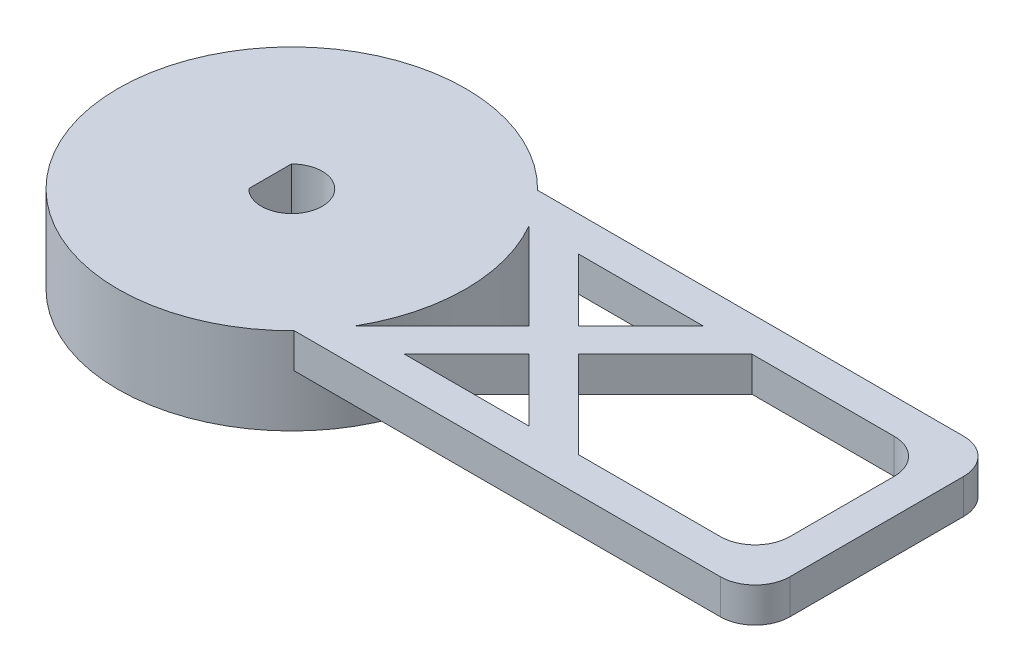
ISO-10303-21;
HEADER;
FILE_DESCRIPTION(('STEP AP214'),'2;1');
FILE_NAME('part.step','',(''),(''),'','','');
FILE_SCHEMA(('AUTOMOTIVE_DESIGN { 1 0 10303 214 1 1 1 1 }'));
ENDSEC;
DATA;
#1=APPLICATION_CONTEXT('core data for automotive mechanical design processes');
#2=APPLICATION_PROTOCOL_DEFINITION('international standard','automotive_design',2000,#1);
#3=PRODUCT_CONTEXT('',#1,'mechanical');
#4=PRODUCT('Part','Part','',(#3));
#5=PRODUCT_RELATED_PRODUCT_CATEGORY('part','',(#4));
#6=PRODUCT_DEFINITION_FORMATION('','',#4);
#7=PRODUCT_DEFINITION_CONTEXT('part definition',#1,'design');
#8=PRODUCT_DEFINITION('design','',#6,#7);
#9=PRODUCT_DEFINITION_SHAPE('','',#8);
#10=(LENGTH_UNIT() NAMED_UNIT(*) SI_UNIT(.MILLI.,.METRE.));
#11=(NAMED_UNIT(*) PLANE_ANGLE_UNIT() SI_UNIT($,.RADIAN.));
#12=(NAMED_UNIT(*) SI_UNIT($,.STERADIAN.) SOLID_ANGLE_UNIT());
#13=UNCERTAINTY_MEASURE_WITH_UNIT(LENGTH_MEASURE(1.E-05),#10,'distance_accuracy_value','');
#14=(GEOMETRIC_REPRESENTATION_CONTEXT(3) GLOBAL_UNCERTAINTY_ASSIGNED_CONTEXT((#13)) GLOBAL_UNIT_ASSIGNED_CONTEXT((#10,
#11,#12)) REPRESENTATION_CONTEXT('',''));
#15=CARTESIAN_POINT('',(0.,0.,0.));
#16=DIRECTION('',(0.,0.,1.));
#17=DIRECTION('',(1.,0.,0.));
#18=AXIS2_PLACEMENT_3D('',#15,#16,#17);
#19=CARTESIAN_POINT('',(8.66025403784439,3.,-5.));
#20=DIRECTION('',(0.,0.,1.));
#21=DIRECTION('',(1.,0.,0.));
#22=AXIS2_PLACEMENT_3D('',#19,#20,#21);
#23=PLANE('',#22);
#24=DIRECTION('',(0.,1.,0.));
#25=VECTOR('',#24,1.);
#26=CARTESIAN_POINT('',(11.4886811625905,3.,-4.99999999999992));
#27=LINE('',#26,#25);
#28=CARTESIAN_POINT('',(11.4886811625905,3.,-4.99999999999992));
#29=VERTEX_POINT('',#28);
#30=CARTESIAN_POINT('',(11.4886811625905,5.,-5.));
#31=VERTEX_POINT('',#30);
#32=EDGE_CURVE('E287',#29,#31,#27,.T.);
#33=ORIENTED_EDGE('',*,*,#32,.F.);
#34=DIRECTION('',(1.,0.,0.));
#35=VECTOR('',#34,1.);
#36=CARTESIAN_POINT('',(8.66025403784439,3.,-5.));
#37=LINE('',#36,#35);
#38=CARTESIAN_POINT('',(18.6602540378445,3.,-5.));
#39=VERTEX_POINT('',#38);
#40=EDGE_CURVE('E353',#29,#39,#37,.T.);
#41=ORIENTED_EDGE('',*,*,#40,.T.);
#42=DIRECTION('',(0.,1.,0.));
#43=VECTOR('',#42,1.);
#44=CARTESIAN_POINT('',(18.6602540378445,3.,-5.00000000000008));
#45=LINE('',#44,#43);
#46=CARTESIAN_POINT('',(18.6602540378445,5.,-5.));
#47=VERTEX_POINT('',#46);
#48=EDGE_CURVE('E295',#39,#47,#45,.T.);
#49=ORIENTED_EDGE('',*,*,#48,.T.);
#50=DIRECTION('',(1.,0.,0.));
#51=VECTOR('',#50,1.);
#52=CARTESIAN_POINT('',(8.66025403784439,5.,-5.));
#53=LINE('',#52,#51);
#54=EDGE_CURVE('E364',#31,#47,#53,.T.);
#55=ORIENTED_EDGE('',*,*,#54,.F.);
#56=EDGE_LOOP('',(#33,#41,#49,#55));
#57=FACE_BOUND('',#56,.T.);
#58=ADVANCED_FACE('F39',(#57),#23,.T.);
#59=CARTESIAN_POINT('',(8.66025403784439,3.,5.));
#60=DIRECTION('',(0.,0.,-1.));
#61=DIRECTION('',(-1.,0.,0.));
#62=AXIS2_PLACEMENT_3D('',#59,#60,#61);
#63=PLANE('',#62);
#64=DIRECTION('',(-1.,0.,0.));
#65=VECTOR('',#64,1.);
#66=CARTESIAN_POINT('',(8.66025403784439,5.,5.));
#67=LINE('',#66,#65);
#68=CARTESIAN_POINT('',(29.6602540378444,5.,5.));
#69=VERTEX_POINT('',#68);
#70=CARTESIAN_POINT('',(21.488681162591,5.,5.));
#71=VERTEX_POINT('',#70);
#72=EDGE_CURVE('E331',#69,#71,#67,.T.);
#73=ORIENTED_EDGE('',*,*,#72,.F.);
#74=DIRECTION('',(0.,1.,0.));
#75=VECTOR('',#74,1.);
#76=CARTESIAN_POINT('',(29.6602540378444,3.,5.));
#77=LINE('',#76,#75);
#78=CARTESIAN_POINT('',(29.6602540378444,3.,5.));
#79=VERTEX_POINT('',#78);
#80=EDGE_CURVE('E422',#69,#79,#77,.F.);
#81=ORIENTED_EDGE('',*,*,#80,.T.);
#82=DIRECTION('',(-1.,0.,0.));
#83=VECTOR('',#82,1.);
#84=CARTESIAN_POINT('',(8.66025403784439,3.,5.));
#85=LINE('',#84,#83);
#86=CARTESIAN_POINT('',(21.488681162591,3.,5.));
#87=VERTEX_POINT('',#86);
#88=EDGE_CURVE('E332',#79,#87,#85,.T.);
#89=ORIENTED_EDGE('',*,*,#88,.T.);
#90=DIRECTION('',(0.,1.,0.));
#91=VECTOR('',#90,1.);
#92=CARTESIAN_POINT('',(21.488681162591,3.,5.));
#93=LINE('',#92,#91);
#94=EDGE_CURVE('E305',#87,#71,#93,.T.);
#95=ORIENTED_EDGE('',*,*,#94,.T.);
#96=EDGE_LOOP('',(#73,#81,#89,#95));
#97=FACE_BOUND('',#96,.T.);
#98=ADVANCED_FACE('F483',(#97),#63,.T.);
#99=CARTESIAN_POINT('',(21.4886811625907,3.,-5.00000000000008));
#100=VERTEX_POINT('',#99);
#101=CARTESIAN_POINT('',(29.6602540378444,3.,-5.));
#102=VERTEX_POINT('',#101);
#103=EDGE_CURVE('E349',#100,#102,#37,.T.);
#104=ORIENTED_EDGE('',*,*,#103,.T.);
#105=DIRECTION('',(0.,-1.,0.));
#106=VECTOR('',#105,1.);
#107=CARTESIAN_POINT('',(29.6602540378444,3.,-5.));
#108=LINE('',#107,#106);
#109=CARTESIAN_POINT('',(29.6602540378444,5.,-5.));
#110=VERTEX_POINT('',#109);
#111=EDGE_CURVE('E425',#102,#110,#108,.F.);
#112=ORIENTED_EDGE('',*,*,#111,.T.);
#113=CARTESIAN_POINT('',(21.4886811625906,5.,-5.));
#114=VERTEX_POINT('',#113);
#115=EDGE_CURVE('E345',#114,#110,#53,.T.);
#116=ORIENTED_EDGE('',*,*,#115,.F.);
#117=DIRECTION('',(0.,1.,0.));
#118=VECTOR('',#117,1.);
#119=CARTESIAN_POINT('',(21.4886811625907,3.,-5.00000000000008));
#120=LINE('',#119,#118);
#121=EDGE_CURVE('E298',#100,#114,#120,.T.);
#122=ORIENTED_EDGE('',*,*,#121,.F.);
#123=EDGE_LOOP('',(#104,#112,#116,#122));
#124=FACE_BOUND('',#123,.T.);
#125=ADVANCED_FACE('F467',(#124),#23,.T.);
#126=DIRECTION('',(0.,1.,0.));
#127=VECTOR('',#126,1.);
#128=CARTESIAN_POINT('',(18.6602540378446,3.,5.));
#129=LINE('',#128,#127);
#130=CARTESIAN_POINT('',(18.6602540378446,3.,5.));
#131=VERTEX_POINT('',#130);
#132=CARTESIAN_POINT('',(18.6602540378446,5.,5.));
#133=VERTEX_POINT('',#132);
#134=EDGE_CURVE('E309',#131,#133,#129,.T.);
#135=ORIENTED_EDGE('',*,*,#134,.F.);
#136=CARTESIAN_POINT('',(11.4886811625907,3.,5.));
#137=VERTEX_POINT('',#136);
#138=EDGE_CURVE('E330',#131,#137,#85,.T.);
#139=ORIENTED_EDGE('',*,*,#138,.T.);
#140=DIRECTION('',(0.,1.,0.));
#141=VECTOR('',#140,1.);
#142=CARTESIAN_POINT('',(11.4886811625907,3.,4.99999999999991));
#143=LINE('',#142,#141);
#144=CARTESIAN_POINT('',(11.4886811625907,5.,5.));
#145=VERTEX_POINT('',#144);
#146=EDGE_CURVE('E214',#137,#145,#143,.T.);
#147=ORIENTED_EDGE('',*,*,#146,.T.);
#148=EDGE_CURVE('E339',#133,#145,#67,.T.);
#149=ORIENTED_EDGE('',*,*,#148,.F.);
#150=EDGE_LOOP('',(#135,#139,#147,#149));
#151=FACE_BOUND('',#150,.T.);
#152=ADVANCED_FACE('F513',(#151),#63,.T.);
#153=CARTESIAN_POINT('',(0.,5.,0.));
#154=DIRECTION('',(0.,1.,0.));
#155=DIRECTION('',(0.,0.,1.));
#156=AXIS2_PLACEMENT_3D('',#153,#154,#155);
#157=PLANE('',#156);
#158=DIRECTION('',(-0.707106781186573,0.,-0.707106781186522));
#159=VECTOR('',#158,1.);
#160=CARTESIAN_POINT('',(11.4886811625905,5.,-4.99999999999992));
#161=LINE('',#160,#159);
#162=CARTESIAN_POINT('',(15.0744676002176,5.,-1.41421356237313));
#163=VERTEX_POINT('',#162);
#164=EDGE_CURVE('E234',#163,#31,#161,.T.);
#165=ORIENTED_EDGE('',*,*,#164,.T.);
#166=ORIENTED_EDGE('',*,*,#54,.T.);
#167=DIRECTION('',(-0.707106781186543,0.,0.707106781186552));
#168=VECTOR('',#167,1.);
#169=CARTESIAN_POINT('',(18.6602540378445,5.,-5.00000000000008));
#170=LINE('',#169,#168);
#171=EDGE_CURVE('E238',#47,#163,#170,.T.);
#172=ORIENTED_EDGE('',*,*,#171,.T.);
#173=EDGE_LOOP('',(#165,#166,#172));
#174=FACE_BOUND('',#173,.T.);
#175=CARTESIAN_POINT('',(0.,5.,0.));
#176=DIRECTION('',(0.,1.,0.));
#177=DIRECTION('',(0.,0.,1.));
#178=AXIS2_PLACEMENT_3D('',#175,#176,#177);
#179=CIRCLE('',#178,10.);
#180=CARTESIAN_POINT('',(8.66025403784439,5.,5.));
#181=VERTEX_POINT('',#180);
#182=CARTESIAN_POINT('',(8.66025403784439,5.,-5.));
#183=VERTEX_POINT('',#182);
#184=EDGE_CURVE('E406',#181,#183,#179,.T.);
#185=ORIENTED_EDGE('',*,*,#184,.T.);
#186=DIRECTION('',(0.707106781186556,0.,0.707106781186539));
#187=VECTOR('',#186,1.);
#188=CARTESIAN_POINT('',(13.6602540378444,5.,0.));
#189=LINE('',#188,#187);
#190=CARTESIAN_POINT('',(13.6602540378444,5.,0.));
#191=VERTEX_POINT('',#190);
#192=EDGE_CURVE('E263',#183,#191,#189,.T.);
#193=ORIENTED_EDGE('',*,*,#192,.T.);
#194=DIRECTION('',(-0.707106781186543,0.,0.707106781186552));
#195=VECTOR('',#194,1.);
#196=CARTESIAN_POINT('',(13.6602540378444,5.,0.));
#197=LINE('',#196,#195);
#198=EDGE_CURVE('E208',#191,#181,#197,.T.);
#199=ORIENTED_EDGE('',*,*,#198,.T.);
#200=EDGE_LOOP('',(#185,#193,#199));
#201=FACE_BOUND('',#200,.T.);
#202=DIRECTION('',(0.,0.,1.));
#203=VECTOR('',#202,1.);
#204=CARTESIAN_POINT('',(31.6602540378444,5.,-10.002));
#205=LINE('',#204,#203);
#206=CARTESIAN_POINT('',(31.6602540378444,5.,-3.));
#207=VERTEX_POINT('',#206);
#208=CARTESIAN_POINT('',(31.6602540378444,5.,3.));
#209=VERTEX_POINT('',#208);
#210=EDGE_CURVE('E291',#207,#209,#205,.T.);
#211=ORIENTED_EDGE('',*,*,#210,.T.);
#212=CARTESIAN_POINT('',(29.6602540378444,5.,3.));
#213=DIRECTION('',(0.,1.,0.));
#214=DIRECTION('',(0.,0.,1.));
#215=AXIS2_PLACEMENT_3D('',#212,#213,#214);
#216=CIRCLE('',#215,2.);
#217=EDGE_CURVE('E452',#209,#69,#216,.F.);
#218=ORIENTED_EDGE('',*,*,#217,.T.);
#219=ORIENTED_EDGE('',*,*,#72,.T.);
#220=DIRECTION('',(-0.707106781186565,0.,-0.70710678118653));
#221=VECTOR('',#220,1.);
#222=CARTESIAN_POINT('',(16.4886811625907,5.,0.));
#223=LINE('',#222,#221);
#224=CARTESIAN_POINT('',(16.4886811625907,5.,0.));
#225=VERTEX_POINT('',#224);
#226=EDGE_CURVE('E276',#71,#225,#223,.T.);
#227=ORIENTED_EDGE('',*,*,#226,.T.);
#228=DIRECTION('',(0.707106781186541,0.,-0.707106781186554));
#229=VECTOR('',#228,1.);
#230=CARTESIAN_POINT('',(16.4886811625907,5.,0.));
#231=LINE('',#230,#229);
#232=EDGE_CURVE('E280',#225,#114,#231,.T.);
#233=ORIENTED_EDGE('',*,*,#232,.T.);
#234=ORIENTED_EDGE('',*,*,#115,.T.);
#235=CARTESIAN_POINT('',(29.6602540378444,5.,-3.));
#236=DIRECTION('',(0.,1.,0.));
#237=DIRECTION('',(0.,0.,1.));
#238=AXIS2_PLACEMENT_3D('',#235,#236,#237);
#239=CIRCLE('',#238,2.);
#240=EDGE_CURVE('E11',#110,#207,#239,.F.);
#241=ORIENTED_EDGE('',*,*,#240,.T.);
#242=EDGE_LOOP('',(#211,#218,#219,#227,#233,#234,#241));
#243=FACE_BOUND('',#242,.T.);
#244=DIRECTION('',(1.,0.,0.));
#245=VECTOR('',#244,1.);
#246=CARTESIAN_POINT('',(7.14142842854285,5.,7.));
#247=LINE('',#246,#245);
#248=CARTESIAN_POINT('',(7.14142842854285,5.,7.));
#249=VERTEX_POINT('',#248);
#250=CARTESIAN_POINT('',(31.6602540378444,5.,7.));
#251=VERTEX_POINT('',#250);
#252=EDGE_CURVE('E325',#249,#251,#247,.T.);
#253=ORIENTED_EDGE('',*,*,#252,.T.);
#254=CARTESIAN_POINT('',(31.6602540378444,5.,5.));
#255=DIRECTION('',(0.,1.,0.));
#256=DIRECTION('',(0.,0.,1.));
#257=AXIS2_PLACEMENT_3D('',#254,#255,#256);
#258=CIRCLE('',#257,2.);
#259=CARTESIAN_POINT('',(33.6602540378444,5.,5.));
#260=VERTEX_POINT('',#259);
#261=EDGE_CURVE('E435',#251,#260,#258,.T.);
#262=ORIENTED_EDGE('',*,*,#261,.T.);
#263=DIRECTION('',(0.,0.,-1.));
#264=VECTOR('',#263,1.);
#265=CARTESIAN_POINT('',(33.6602540378444,5.,-7.));
#266=LINE('',#265,#264);
#267=CARTESIAN_POINT('',(33.6602540378444,5.,-5.));
#268=VERTEX_POINT('',#267);
#269=EDGE_CURVE('E365',#260,#268,#266,.T.);
#270=ORIENTED_EDGE('',*,*,#269,.T.);
#271=CARTESIAN_POINT('',(31.6602540378444,5.,-5.));
#272=DIRECTION('',(0.,1.,0.));
#273=DIRECTION('',(0.,0.,1.));
#274=AXIS2_PLACEMENT_3D('',#271,#272,#273);
#275=CIRCLE('',#274,2.);
#276=CARTESIAN_POINT('',(31.6602540378444,5.,-7.));
#277=VERTEX_POINT('',#276);
#278=EDGE_CURVE('E432',#268,#277,#275,.T.);
#279=ORIENTED_EDGE('',*,*,#278,.T.);
#280=DIRECTION('',(-1.,0.,0.));
#281=VECTOR('',#280,1.);
#282=CARTESIAN_POINT('',(7.14142842854285,5.,-7.));
#283=LINE('',#282,#281);
#284=CARTESIAN_POINT('',(7.14142842854286,5.,-7.));
#285=VERTEX_POINT('',#284);
#286=EDGE_CURVE('E354',#277,#285,#283,.T.);
#287=ORIENTED_EDGE('',*,*,#286,.T.);
#288=EDGE_CURVE('E401',#285,#249,#179,.T.);
#289=ORIENTED_EDGE('',*,*,#288,.T.);
#290=EDGE_LOOP('',(#253,#262,#270,#279,#287,#289));
#291=FACE_BOUND('',#290,.T.);
#292=DIRECTION('',(0.707106781186565,0.,0.70710678118653));
#293=VECTOR('',#292,1.);
#294=CARTESIAN_POINT('',(18.6602540378446,5.,5.));
#295=LINE('',#294,#293);
#296=CARTESIAN_POINT('',(15.0744676002176,5.,1.41421356237312));
#297=VERTEX_POINT('',#296);
#298=EDGE_CURVE('E272',#297,#133,#295,.T.);
#299=ORIENTED_EDGE('',*,*,#298,.T.);
#300=ORIENTED_EDGE('',*,*,#148,.T.);
#301=DIRECTION('',(0.707106781186556,0.,-0.707106781186539));
#302=VECTOR('',#301,1.);
#303=CARTESIAN_POINT('',(11.4886811625907,5.,4.99999999999991));
#304=LINE('',#303,#302);
#305=EDGE_CURVE('E268',#145,#297,#304,.T.);
#306=ORIENTED_EDGE('',*,*,#305,.T.);
#307=EDGE_LOOP('',(#299,#300,#306));
#308=FACE_BOUND('',#307,.T.);
#309=DIRECTION('',(0.,0.,1.));
#310=VECTOR('',#309,1.);
#311=CARTESIAN_POINT('',(-1.25,5.,1.22474487139159));
#312=LINE('',#311,#310);
#313=CARTESIAN_POINT('',(-1.25,5.,-1.22474487139159));
#314=VERTEX_POINT('',#313);
#315=CARTESIAN_POINT('',(-1.25,5.,1.22474487139159));
#316=VERTEX_POINT('',#315);
#317=EDGE_CURVE('E382',#314,#316,#312,.T.);
#318=ORIENTED_EDGE('',*,*,#317,.F.);
#319=CARTESIAN_POINT('',(0.,5.,0.));
#320=DIRECTION('',(0.,1.,0.));
#321=DIRECTION('',(0.,0.,1.));
#322=AXIS2_PLACEMENT_3D('',#319,#320,#321);
#323=CIRCLE('',#322,1.75);
#324=EDGE_CURVE('E378',#316,#314,#323,.T.);
#325=ORIENTED_EDGE('',*,*,#324,.F.);
#326=EDGE_LOOP('',(#318,#325));
#327=FACE_BOUND('',#326,.T.);
#328=ADVANCED_FACE('F472',(#174,#201,#243,#291,#308,#327),#157,.T.);
#329=CARTESIAN_POINT('',(0.,0.,0.));
#330=DIRECTION('',(0.,1.,0.));
#331=DIRECTION('',(0.,0.,1.));
#332=AXIS2_PLACEMENT_3D('',#329,#330,#331);
#333=PLANE('',#332);
#334=CARTESIAN_POINT('',(0.,0.,0.));
#335=DIRECTION('',(0.,1.,0.));
#336=DIRECTION('',(0.,0.,1.));
#337=AXIS2_PLACEMENT_3D('',#334,#335,#336);
#338=CIRCLE('',#337,10.);
#339=CARTESIAN_POINT('',(0.,0.,10.));
#340=VERTEX_POINT('',#339);
#341=EDGE_CURVE('E400',#340,#340,#338,.T.);
#342=ORIENTED_EDGE('',*,*,#341,.F.);
#343=EDGE_LOOP('',(#342));
#344=FACE_BOUND('',#343,.T.);
#345=CARTESIAN_POINT('',(0.,0.,0.));
#346=DIRECTION('',(0.,1.,0.));
#347=DIRECTION('',(0.,0.,1.));
#348=AXIS2_PLACEMENT_3D('',#345,#346,#347);
#349=CIRCLE('',#348,1.75);
#350=CARTESIAN_POINT('',(-1.25,0.,1.22474487139159));
#351=VERTEX_POINT('',#350);
#352=CARTESIAN_POINT('',(-1.25,0.,-1.22474487139159));
#353=VERTEX_POINT('',#352);
#354=EDGE_CURVE('E375',#351,#353,#349,.T.);
#355=ORIENTED_EDGE('',*,*,#354,.T.);
#356=DIRECTION('',(0.,0.,1.));
#357=VECTOR('',#356,1.);
#358=CARTESIAN_POINT('',(-1.25,0.,1.22474487139159));
#359=LINE('',#358,#357);
#360=EDGE_CURVE('E383',#353,#351,#359,.T.);
#361=ORIENTED_EDGE('',*,*,#360,.T.);
#362=EDGE_LOOP('',(#355,#361));
#363=FACE_BOUND('',#362,.T.);
#364=ADVANCED_FACE('F526',(#344,#363),#333,.F.);
#365=CARTESIAN_POINT('',(0.,5.,0.));
#366=DIRECTION('',(0.,-1.,0.));
#367=DIRECTION('',(0.,0.,-1.));
#368=AXIS2_PLACEMENT_3D('',#365,#366,#367);
#369=CYLINDRICAL_SURFACE('',#368,10.);
#370=ORIENTED_EDGE('',*,*,#184,.F.);
#371=DIRECTION('',(0.,1.,0.));
#372=VECTOR('',#371,1.);
#373=CARTESIAN_POINT('',(8.66025403784439,3.,5.));
#374=LINE('',#373,#372);
#375=CARTESIAN_POINT('',(8.66025403784439,3.,5.));
#376=VERTEX_POINT('',#375);
#377=EDGE_CURVE('E342',#376,#181,#374,.T.);
#378=ORIENTED_EDGE('',*,*,#377,.F.);
#379=CARTESIAN_POINT('',(0.,3.,0.));
#380=DIRECTION('',(0.,-1.,0.));
#381=DIRECTION('',(0.,0.,-1.));
#382=AXIS2_PLACEMENT_3D('',#379,#380,#381);
#383=CIRCLE('',#382,10.);
#384=CARTESIAN_POINT('',(7.14142842854285,3.,7.));
#385=VERTEX_POINT('',#384);
#386=EDGE_CURVE('E225',#376,#385,#383,.T.);
#387=ORIENTED_EDGE('',*,*,#386,.T.);
#388=DIRECTION('',(0.,1.,0.));
#389=VECTOR('',#388,1.);
#390=CARTESIAN_POINT('',(7.14142842854285,3.,7.));
#391=LINE('',#390,#389);
#392=EDGE_CURVE('E335',#385,#249,#391,.T.);
#393=ORIENTED_EDGE('',*,*,#392,.T.);
#394=ORIENTED_EDGE('',*,*,#288,.F.);
#395=DIRECTION('',(0.,1.,0.));
#396=VECTOR('',#395,1.);
#397=CARTESIAN_POINT('',(7.14142842854285,3.,-7.));
#398=LINE('',#397,#396);
#399=CARTESIAN_POINT('',(7.14142842854285,3.,-7.));
#400=VERTEX_POINT('',#399);
#401=EDGE_CURVE('E371',#400,#285,#398,.T.);
#402=ORIENTED_EDGE('',*,*,#401,.F.);
#403=CARTESIAN_POINT('',(0.,3.,0.));
#404=DIRECTION('',(0.,1.,0.));
#405=DIRECTION('',(0.,0.,1.));
#406=AXIS2_PLACEMENT_3D('',#403,#404,#405);
#407=CIRCLE('',#406,10.);
#408=CARTESIAN_POINT('',(8.66025403784439,3.,-5.));
#409=VERTEX_POINT('',#408);
#410=EDGE_CURVE('E405',#409,#400,#407,.T.);
#411=ORIENTED_EDGE('',*,*,#410,.F.);
#412=DIRECTION('',(0.,1.,0.));
#413=VECTOR('',#412,1.);
#414=CARTESIAN_POINT('',(8.66025403784439,3.,-5.));
#415=LINE('',#414,#413);
#416=EDGE_CURVE('E232',#409,#183,#415,.T.);
#417=ORIENTED_EDGE('',*,*,#416,.T.);
#418=EDGE_LOOP('',(#370,#378,#387,#393,#394,#402,#411,#417));
#419=FACE_BOUND('',#418,.T.);
#420=ORIENTED_EDGE('',*,*,#341,.T.);
#421=EDGE_LOOP('',(#420));
#422=FACE_BOUND('',#421,.T.);
#423=ADVANCED_FACE('F557',(#419,#422),#369,.T.);
#424=CARTESIAN_POINT('',(0.,5.,0.));
#425=DIRECTION('',(0.,-1.,0.));
#426=DIRECTION('',(0.,0.,-1.));
#427=AXIS2_PLACEMENT_3D('',#424,#425,#426);
#428=CYLINDRICAL_SURFACE('',#427,1.75);
#429=ORIENTED_EDGE('',*,*,#354,.F.);
#430=DIRECTION('',(0.,-1.,0.));
#431=VECTOR('',#430,1.);
#432=CARTESIAN_POINT('',(-1.25,5.,1.22474487139159));
#433=LINE('',#432,#431);
#434=EDGE_CURVE('E386',#316,#351,#433,.T.);
#435=ORIENTED_EDGE('',*,*,#434,.F.);
#436=ORIENTED_EDGE('',*,*,#324,.T.);
#437=DIRECTION('',(0.,-1.,0.));
#438=VECTOR('',#437,1.);
#439=CARTESIAN_POINT('',(-1.25,5.,-1.22474487139159));
#440=LINE('',#439,#438);
#441=EDGE_CURVE('E396',#314,#353,#440,.T.);
#442=ORIENTED_EDGE('',*,*,#441,.T.);
#443=EDGE_LOOP('',(#429,#435,#436,#442));
#444=FACE_BOUND('',#443,.T.);
#445=ADVANCED_FACE('F574',(#444),#428,.F.);
#446=CARTESIAN_POINT('',(-1.25,5.,1.22474487139159));
#447=DIRECTION('',(1.,0.,0.));
#448=DIRECTION('',(0.,0.,-1.));
#449=AXIS2_PLACEMENT_3D('',#446,#447,#448);
#450=PLANE('',#449);
#451=ORIENTED_EDGE('',*,*,#360,.F.);
#452=ORIENTED_EDGE('',*,*,#441,.F.);
#453=ORIENTED_EDGE('',*,*,#317,.T.);
#454=ORIENTED_EDGE('',*,*,#434,.T.);
#455=EDGE_LOOP('',(#451,#452,#453,#454));
#456=FACE_BOUND('',#455,.T.);
#457=ADVANCED_FACE('F543',(#456),#450,.T.);
#458=CARTESIAN_POINT('',(7.14142842854285,3.,-7.));
#459=DIRECTION('',(0.,0.,-1.));
#460=DIRECTION('',(-1.,0.,0.));
#461=AXIS2_PLACEMENT_3D('',#458,#459,#460);
#462=PLANE('',#461);
#463=ORIENTED_EDGE('',*,*,#286,.F.);
#464=DIRECTION('',(0.,1.,0.));
#465=VECTOR('',#464,1.);
#466=CARTESIAN_POINT('',(31.6602540378444,3.,-7.));
#467=LINE('',#466,#465);
#468=CARTESIAN_POINT('',(31.6602540378444,3.,-7.));
#469=VERTEX_POINT('',#468);
#470=EDGE_CURVE('E55',#277,#469,#467,.F.);
#471=ORIENTED_EDGE('',*,*,#470,.T.);
#472=DIRECTION('',(-1.,0.,0.));
#473=VECTOR('',#472,1.);
#474=CARTESIAN_POINT('',(7.14142842854285,3.,-7.));
#475=LINE('',#474,#473);
#476=EDGE_CURVE('E358',#469,#400,#475,.T.);
#477=ORIENTED_EDGE('',*,*,#476,.T.);
#478=ORIENTED_EDGE('',*,*,#401,.T.);
#479=EDGE_LOOP('',(#463,#471,#477,#478));
#480=FACE_BOUND('',#479,.T.);
#481=ADVANCED_FACE('F541',(#480),#462,.T.);
#482=CARTESIAN_POINT('',(33.6602540378444,3.,-7.));
#483=DIRECTION('',(1.,0.,0.));
#484=DIRECTION('',(0.,0.,-1.));
#485=AXIS2_PLACEMENT_3D('',#482,#483,#484);
#486=PLANE('',#485);
#487=ORIENTED_EDGE('',*,*,#269,.F.);
#488=DIRECTION('',(0.,1.,0.));
#489=VECTOR('',#488,1.);
#490=CARTESIAN_POINT('',(33.6602540378444,3.,5.));
#491=LINE('',#490,#489);
#492=CARTESIAN_POINT('',(33.6602540378444,3.,5.));
#493=VERTEX_POINT('',#492);
#494=EDGE_CURVE('E442',#260,#493,#491,.F.);
#495=ORIENTED_EDGE('',*,*,#494,.T.);
#496=DIRECTION('',(0.,0.,-1.));
#497=VECTOR('',#496,1.);
#498=CARTESIAN_POINT('',(33.6602540378444,3.,-7.));
#499=LINE('',#498,#497);
#500=CARTESIAN_POINT('',(33.6602540378444,3.,-5.));
#501=VERTEX_POINT('',#500);
#502=EDGE_CURVE('E355',#493,#501,#499,.T.);
#503=ORIENTED_EDGE('',*,*,#502,.T.);
#504=DIRECTION('',(0.,1.,0.));
#505=VECTOR('',#504,1.);
#506=CARTESIAN_POINT('',(33.6602540378444,3.,-5.));
#507=LINE('',#506,#505);
#508=EDGE_CURVE('E438',#501,#268,#507,.T.);
#509=ORIENTED_EDGE('',*,*,#508,.T.);
#510=EDGE_LOOP('',(#487,#495,#503,#509));
#511=FACE_BOUND('',#510,.T.);
#512=ADVANCED_FACE('F539',(#511),#486,.T.);
#513=CARTESIAN_POINT('',(0.,3.,0.));
#514=DIRECTION('',(0.,1.,0.));
#515=DIRECTION('',(0.,0.,1.));
#516=AXIS2_PLACEMENT_3D('',#513,#514,#515);
#517=PLANE('',#516);
#518=ORIENTED_EDGE('',*,*,#40,.F.);
#519=DIRECTION('',(-0.707106781186573,0.,-0.707106781186522));
#520=VECTOR('',#519,1.);
#521=CARTESIAN_POINT('',(11.4886811625905,3.,-4.99999999999992));
#522=LINE('',#521,#520);
#523=CARTESIAN_POINT('',(15.0744676002176,3.,-1.41421356237313));
#524=VERTEX_POINT('',#523);
#525=EDGE_CURVE('E215',#524,#29,#522,.T.);
#526=ORIENTED_EDGE('',*,*,#525,.F.);
#527=DIRECTION('',(-0.707106781186543,0.,0.707106781186552));
#528=VECTOR('',#527,1.);
#529=CARTESIAN_POINT('',(18.6602540378445,3.,-5.00000000000008));
#530=LINE('',#529,#528);
#531=EDGE_CURVE('E256',#39,#524,#530,.T.);
#532=ORIENTED_EDGE('',*,*,#531,.F.);
#533=EDGE_LOOP('',(#518,#526,#532));
#534=FACE_BOUND('',#533,.T.);
#535=ORIENTED_EDGE('',*,*,#502,.F.);
#536=CARTESIAN_POINT('',(31.6602540378444,3.,5.));
#537=DIRECTION('',(0.,1.,0.));
#538=DIRECTION('',(0.,0.,1.));
#539=AXIS2_PLACEMENT_3D('',#536,#537,#538);
#540=CIRCLE('',#539,2.);
#541=CARTESIAN_POINT('',(31.6602540378444,3.,7.));
#542=VERTEX_POINT('',#541);
#543=EDGE_CURVE('E447',#493,#542,#540,.F.);
#544=ORIENTED_EDGE('',*,*,#543,.T.);
#545=DIRECTION('',(1.,0.,0.));
#546=VECTOR('',#545,1.);
#547=CARTESIAN_POINT('',(7.14142842854285,3.,7.));
#548=LINE('',#547,#546);
#549=EDGE_CURVE('E326',#385,#542,#548,.T.);
#550=ORIENTED_EDGE('',*,*,#549,.F.);
#551=ORIENTED_EDGE('',*,*,#386,.F.);
#552=DIRECTION('',(-0.707106781186543,0.,0.707106781186552));
#553=VECTOR('',#552,1.);
#554=CARTESIAN_POINT('',(13.6602540378444,3.,0.));
#555=LINE('',#554,#553);
#556=CARTESIAN_POINT('',(13.6602540378444,3.,0.));
#557=VERTEX_POINT('',#556);
#558=EDGE_CURVE('E206',#557,#376,#555,.T.);
#559=ORIENTED_EDGE('',*,*,#558,.F.);
#560=DIRECTION('',(0.707106781186556,0.,0.707106781186539));
#561=VECTOR('',#560,1.);
#562=CARTESIAN_POINT('',(13.6602540378444,3.,0.));
#563=LINE('',#562,#561);
#564=EDGE_CURVE('E222',#409,#557,#563,.T.);
#565=ORIENTED_EDGE('',*,*,#564,.F.);
#566=ORIENTED_EDGE('',*,*,#410,.T.);
#567=ORIENTED_EDGE('',*,*,#476,.F.);
#568=CARTESIAN_POINT('',(31.6602540378444,3.,-5.));
#569=DIRECTION('',(0.,1.,0.));
#570=DIRECTION('',(0.,0.,1.));
#571=AXIS2_PLACEMENT_3D('',#568,#569,#570);
#572=CIRCLE('',#571,2.);
#573=EDGE_CURVE('E62',#469,#501,#572,.F.);
#574=ORIENTED_EDGE('',*,*,#573,.T.);
#575=EDGE_LOOP('',(#535,#544,#550,#551,#559,#565,#566,#567,#574));
#576=FACE_BOUND('',#575,.T.);
#577=DIRECTION('',(-0.707106781186565,0.,-0.70710678118653));
#578=VECTOR('',#577,1.);
#579=CARTESIAN_POINT('',(16.4886811625907,3.,0.));
#580=LINE('',#579,#578);
#581=CARTESIAN_POINT('',(16.4886811625907,3.,0.));
#582=VERTEX_POINT('',#581);
#583=EDGE_CURVE('E248',#87,#582,#580,.T.);
#584=ORIENTED_EDGE('',*,*,#583,.F.);
#585=ORIENTED_EDGE('',*,*,#88,.F.);
#586=CARTESIAN_POINT('',(29.6602540378444,3.,3.));
#587=DIRECTION('',(0.,1.,0.));
#588=DIRECTION('',(0.,0.,1.));
#589=AXIS2_PLACEMENT_3D('',#586,#587,#588);
#590=CIRCLE('',#589,2.);
#591=CARTESIAN_POINT('',(31.6602540378444,3.,3.));
#592=VERTEX_POINT('',#591);
#593=EDGE_CURVE('E455',#79,#592,#590,.T.);
#594=ORIENTED_EDGE('',*,*,#593,.T.);
#595=DIRECTION('',(0.,0.,1.));
#596=VECTOR('',#595,1.);
#597=CARTESIAN_POINT('',(31.6602540378444,3.,-10.002));
#598=LINE('',#597,#596);
#599=CARTESIAN_POINT('',(31.6602540378444,3.,-3.));
#600=VERTEX_POINT('',#599);
#601=EDGE_CURVE('E321',#600,#592,#598,.T.);
#602=ORIENTED_EDGE('',*,*,#601,.F.);
#603=CARTESIAN_POINT('',(29.6602540378444,3.,-3.));
#604=DIRECTION('',(0.,1.,0.));
#605=DIRECTION('',(0.,0.,1.));
#606=AXIS2_PLACEMENT_3D('',#603,#604,#605);
#607=CIRCLE('',#606,2.);
#608=EDGE_CURVE('E48',#600,#102,#607,.T.);
#609=ORIENTED_EDGE('',*,*,#608,.T.);
#610=ORIENTED_EDGE('',*,*,#103,.F.);
#611=DIRECTION('',(0.707106781186541,0.,-0.707106781186554));
#612=VECTOR('',#611,1.);
#613=CARTESIAN_POINT('',(16.4886811625907,3.,0.));
#614=LINE('',#613,#612);
#615=EDGE_CURVE('E252',#582,#100,#614,.T.);
#616=ORIENTED_EDGE('',*,*,#615,.F.);
#617=EDGE_LOOP('',(#584,#585,#594,#602,#609,#610,#616));
#618=FACE_BOUND('',#617,.T.);
#619=ORIENTED_EDGE('',*,*,#138,.F.);
#620=DIRECTION('',(0.707106781186565,0.,0.70710678118653));
#621=VECTOR('',#620,1.);
#622=CARTESIAN_POINT('',(18.6602540378446,3.,5.));
#623=LINE('',#622,#621);
#624=CARTESIAN_POINT('',(15.0744676002176,3.,1.41421356237312));
#625=VERTEX_POINT('',#624);
#626=EDGE_CURVE('E244',#625,#131,#623,.T.);
#627=ORIENTED_EDGE('',*,*,#626,.F.);
#628=DIRECTION('',(0.707106781186556,0.,-0.707106781186539));
#629=VECTOR('',#628,1.);
#630=CARTESIAN_POINT('',(11.4886811625907,3.,4.99999999999991));
#631=LINE('',#630,#629);
#632=EDGE_CURVE('E227',#137,#625,#631,.T.);
#633=ORIENTED_EDGE('',*,*,#632,.F.);
#634=EDGE_LOOP('',(#619,#627,#633));
#635=FACE_BOUND('',#634,.T.);
#636=ADVANCED_FACE('F219',(#534,#576,#618,#635),#517,.F.);
#637=CARTESIAN_POINT('',(7.14142842854285,3.,7.));
#638=DIRECTION('',(0.,0.,1.));
#639=DIRECTION('',(1.,0.,0.));
#640=AXIS2_PLACEMENT_3D('',#637,#638,#639);
#641=PLANE('',#640);
#642=ORIENTED_EDGE('',*,*,#549,.T.);
#643=DIRECTION('',(0.,1.,0.));
#644=VECTOR('',#643,1.);
#645=CARTESIAN_POINT('',(31.6602540378444,3.,7.));
#646=LINE('',#645,#644);
#647=EDGE_CURVE('E428',#542,#251,#646,.T.);
#648=ORIENTED_EDGE('',*,*,#647,.T.);
#649=ORIENTED_EDGE('',*,*,#252,.F.);
#650=ORIENTED_EDGE('',*,*,#392,.F.);
#651=EDGE_LOOP('',(#642,#648,#649,#650));
#652=FACE_BOUND('',#651,.T.);
#653=ADVANCED_FACE('F533',(#652),#641,.T.);
#654=CARTESIAN_POINT('',(31.6602540378444,3.,-10.002));
#655=DIRECTION('',(1.,0.,0.));
#656=DIRECTION('',(0.,0.,-1.));
#657=AXIS2_PLACEMENT_3D('',#654,#655,#656);
#658=PLANE('',#657);
#659=ORIENTED_EDGE('',*,*,#601,.T.);
#660=DIRECTION('',(0.,1.,0.));
#661=VECTOR('',#660,1.);
#662=CARTESIAN_POINT('',(31.6602540378444,3.,3.));
#663=LINE('',#662,#661);
#664=EDGE_CURVE('E418',#592,#209,#663,.T.);
#665=ORIENTED_EDGE('',*,*,#664,.T.);
#666=ORIENTED_EDGE('',*,*,#210,.F.);
#667=DIRECTION('',(0.,-1.,0.));
#668=VECTOR('',#667,1.);
#669=CARTESIAN_POINT('',(31.6602540378444,3.,-3.));
#670=LINE('',#669,#668);
#671=EDGE_CURVE('E414',#207,#600,#670,.T.);
#672=ORIENTED_EDGE('',*,*,#671,.T.);
#673=EDGE_LOOP('',(#659,#665,#666,#672));
#674=FACE_BOUND('',#673,.T.);
#675=ADVANCED_FACE('F475',(#674),#658,.F.);
#676=CARTESIAN_POINT('',(11.4886811625905,3.,-4.99999999999992));
#677=DIRECTION('',(0.707106781186522,0.,-0.707106781186573));
#678=DIRECTION('',(-0.707106781186573,0.,-0.707106781186522));
#679=AXIS2_PLACEMENT_3D('',#676,#677,#678);
#680=PLANE('',#679);
#681=ORIENTED_EDGE('',*,*,#164,.F.);
#682=DIRECTION('',(0.,1.,0.));
#683=VECTOR('',#682,1.);
#684=CARTESIAN_POINT('',(15.0744676002176,3.,-1.41421356237313));
#685=LINE('',#684,#683);
#686=EDGE_CURVE('E292',#524,#163,#685,.T.);
#687=ORIENTED_EDGE('',*,*,#686,.F.);
#688=ORIENTED_EDGE('',*,*,#525,.T.);
#689=ORIENTED_EDGE('',*,*,#32,.T.);
#690=EDGE_LOOP('',(#681,#687,#688,#689));
#691=FACE_BOUND('',#690,.T.);
#692=ADVANCED_FACE('F501',(#691),#680,.T.);
#693=CARTESIAN_POINT('',(18.6602540378445,3.,-5.00000000000008));
#694=DIRECTION('',(-0.707106781186552,0.,-0.707106781186543));
#695=DIRECTION('',(-0.707106781186543,0.,0.707106781186552));
#696=AXIS2_PLACEMENT_3D('',#693,#694,#695);
#697=PLANE('',#696);
#698=ORIENTED_EDGE('',*,*,#171,.F.);
#699=ORIENTED_EDGE('',*,*,#48,.F.);
#700=ORIENTED_EDGE('',*,*,#531,.T.);
#701=ORIENTED_EDGE('',*,*,#686,.T.);
#702=EDGE_LOOP('',(#698,#699,#700,#701));
#703=FACE_BOUND('',#702,.T.);
#704=ADVANCED_FACE('F493',(#703),#697,.T.);
#705=CARTESIAN_POINT('',(16.4886811625907,3.,0.));
#706=DIRECTION('',(0.707106781186554,0.,0.707106781186541));
#707=DIRECTION('',(0.707106781186541,0.,-0.707106781186554));
#708=AXIS2_PLACEMENT_3D('',#705,#706,#707);
#709=PLANE('',#708);
#710=ORIENTED_EDGE('',*,*,#232,.F.);
#711=DIRECTION('',(0.,1.,0.));
#712=VECTOR('',#711,1.);
#713=CARTESIAN_POINT('',(16.4886811625907,3.,0.));
#714=LINE('',#713,#712);
#715=EDGE_CURVE('E302',#582,#225,#714,.T.);
#716=ORIENTED_EDGE('',*,*,#715,.F.);
#717=ORIENTED_EDGE('',*,*,#615,.T.);
#718=ORIENTED_EDGE('',*,*,#121,.T.);
#719=EDGE_LOOP('',(#710,#716,#717,#718));
#720=FACE_BOUND('',#719,.T.);
#721=ADVANCED_FACE('F491',(#720),#709,.T.);
#722=CARTESIAN_POINT('',(16.4886811625907,3.,0.));
#723=DIRECTION('',(0.70710678118653,0.,-0.707106781186565));
#724=DIRECTION('',(-0.707106781186565,0.,-0.70710678118653));
#725=AXIS2_PLACEMENT_3D('',#722,#723,#724);
#726=PLANE('',#725);
#727=ORIENTED_EDGE('',*,*,#226,.F.);
#728=ORIENTED_EDGE('',*,*,#94,.F.);
#729=ORIENTED_EDGE('',*,*,#583,.T.);
#730=ORIENTED_EDGE('',*,*,#715,.T.);
#731=EDGE_LOOP('',(#727,#728,#729,#730));
#732=FACE_BOUND('',#731,.T.);
#733=ADVANCED_FACE('F488',(#732),#726,.T.);
#734=CARTESIAN_POINT('',(18.6602540378446,3.,5.));
#735=DIRECTION('',(-0.70710678118653,0.,0.707106781186565));
#736=DIRECTION('',(0.707106781186565,0.,0.70710678118653));
#737=AXIS2_PLACEMENT_3D('',#734,#735,#736);
#738=PLANE('',#737);
#739=ORIENTED_EDGE('',*,*,#298,.F.);
#740=DIRECTION('',(0.,1.,0.));
#741=VECTOR('',#740,1.);
#742=CARTESIAN_POINT('',(15.0744676002176,3.,1.41421356237312));
#743=LINE('',#742,#741);
#744=EDGE_CURVE('E313',#625,#297,#743,.T.);
#745=ORIENTED_EDGE('',*,*,#744,.F.);
#746=ORIENTED_EDGE('',*,*,#626,.T.);
#747=ORIENTED_EDGE('',*,*,#134,.T.);
#748=EDGE_LOOP('',(#739,#745,#746,#747));
#749=FACE_BOUND('',#748,.T.);
#750=ADVANCED_FACE('F499',(#749),#738,.T.);
#751=CARTESIAN_POINT('',(11.4886811625907,3.,4.99999999999991));
#752=DIRECTION('',(0.707106781186539,0.,0.707106781186556));
#753=DIRECTION('',(0.707106781186556,0.,-0.707106781186539));
#754=AXIS2_PLACEMENT_3D('',#751,#752,#753);
#755=PLANE('',#754);
#756=ORIENTED_EDGE('',*,*,#305,.F.);
#757=ORIENTED_EDGE('',*,*,#146,.F.);
#758=ORIENTED_EDGE('',*,*,#632,.T.);
#759=ORIENTED_EDGE('',*,*,#744,.T.);
#760=EDGE_LOOP('',(#756,#757,#758,#759));
#761=FACE_BOUND('',#760,.T.);
#762=ADVANCED_FACE('F676',(#761),#755,.T.);
#763=CARTESIAN_POINT('',(13.6602540378444,3.,0.));
#764=DIRECTION('',(-0.707106781186552,0.,-0.707106781186543));
#765=DIRECTION('',(-0.707106781186543,0.,0.707106781186552));
#766=AXIS2_PLACEMENT_3D('',#763,#764,#765);
#767=PLANE('',#766);
#768=ORIENTED_EDGE('',*,*,#198,.F.);
#769=DIRECTION('',(0.,1.,0.));
#770=VECTOR('',#769,1.);
#771=CARTESIAN_POINT('',(13.6602540378444,3.,0.));
#772=LINE('',#771,#770);
#773=EDGE_CURVE('E202',#557,#191,#772,.T.);
#774=ORIENTED_EDGE('',*,*,#773,.F.);
#775=ORIENTED_EDGE('',*,*,#558,.T.);
#776=ORIENTED_EDGE('',*,*,#377,.T.);
#777=EDGE_LOOP('',(#768,#774,#775,#776));
#778=FACE_BOUND('',#777,.T.);
#779=ADVANCED_FACE('F204',(#778),#767,.T.);
#780=CARTESIAN_POINT('',(13.6602540378444,3.,0.));
#781=DIRECTION('',(-0.707106781186539,0.,0.707106781186556));
#782=DIRECTION('',(0.707106781186556,0.,0.707106781186539));
#783=AXIS2_PLACEMENT_3D('',#780,#781,#782);
#784=PLANE('',#783);
#785=ORIENTED_EDGE('',*,*,#192,.F.);
#786=ORIENTED_EDGE('',*,*,#416,.F.);
#787=ORIENTED_EDGE('',*,*,#564,.T.);
#788=ORIENTED_EDGE('',*,*,#773,.T.);
#789=EDGE_LOOP('',(#785,#786,#787,#788));
#790=FACE_BOUND('',#789,.T.);
#791=ADVANCED_FACE('F230',(#790),#784,.T.);
#792=CARTESIAN_POINT('',(29.6602540378444,3.,3.));
#793=DIRECTION('',(0.,1.,0.));
#794=DIRECTION('',(0.,0.,1.));
#795=AXIS2_PLACEMENT_3D('',#792,#793,#794);
#796=CYLINDRICAL_SURFACE('',#795,2.);
#797=ORIENTED_EDGE('',*,*,#593,.F.);
#798=ORIENTED_EDGE('',*,*,#80,.F.);
#799=ORIENTED_EDGE('',*,*,#217,.F.);
#800=ORIENTED_EDGE('',*,*,#664,.F.);
#801=EDGE_LOOP('',(#797,#798,#799,#800));
#802=FACE_BOUND('',#801,.T.);
#803=ADVANCED_FACE('F479',(#802),#796,.F.);
#804=CARTESIAN_POINT('',(29.6602540378444,3.,-3.));
#805=DIRECTION('',(0.,-1.,0.));
#806=DIRECTION('',(0.,0.,-1.));
#807=AXIS2_PLACEMENT_3D('',#804,#805,#806);
#808=CYLINDRICAL_SURFACE('',#807,2.);
#809=ORIENTED_EDGE('',*,*,#240,.F.);
#810=ORIENTED_EDGE('',*,*,#111,.F.);
#811=ORIENTED_EDGE('',*,*,#608,.F.);
#812=ORIENTED_EDGE('',*,*,#671,.F.);
#813=EDGE_LOOP('',(#809,#810,#811,#812));
#814=FACE_BOUND('',#813,.T.);
#815=ADVANCED_FACE('F469',(#814),#808,.F.);
#816=CARTESIAN_POINT('',(31.6602540378444,3.,5.));
#817=DIRECTION('',(0.,1.,0.));
#818=DIRECTION('',(0.,0.,1.));
#819=AXIS2_PLACEMENT_3D('',#816,#817,#818);
#820=CYLINDRICAL_SURFACE('',#819,2.);
#821=ORIENTED_EDGE('',*,*,#543,.F.);
#822=ORIENTED_EDGE('',*,*,#494,.F.);
#823=ORIENTED_EDGE('',*,*,#261,.F.);
#824=ORIENTED_EDGE('',*,*,#647,.F.);
#825=EDGE_LOOP('',(#821,#822,#823,#824));
#826=FACE_BOUND('',#825,.T.);
#827=ADVANCED_FACE('F553',(#826),#820,.T.);
#828=CARTESIAN_POINT('',(31.6602540378444,3.,-5.));
#829=DIRECTION('',(0.,1.,0.));
#830=DIRECTION('',(0.,0.,1.));
#831=AXIS2_PLACEMENT_3D('',#828,#829,#830);
#832=CYLINDRICAL_SURFACE('',#831,2.);
#833=ORIENTED_EDGE('',*,*,#573,.F.);
#834=ORIENTED_EDGE('',*,*,#470,.F.);
#835=ORIENTED_EDGE('',*,*,#278,.F.);
#836=ORIENTED_EDGE('',*,*,#508,.F.);
#837=EDGE_LOOP('',(#833,#834,#835,#836));
#838=FACE_BOUND('',#837,.T.);
#839=ADVANCED_FACE('F41',(#838),#832,.T.);
#840=CLOSED_SHELL('',(#58,#98,#125,#152,#328,#364,#423,#445,#457,#481,#512,#636,#653,#675,#692,
#704,#721,#733,#750,#762,#779,#791,#803,#815,#827,#839));
#841=MANIFOLD_SOLID_BREP('B2',#840);
#842=ADVANCED_BREP_SHAPE_REPRESENTATION('',(#18,#841),#14);
#843=SHAPE_DEFINITION_REPRESENTATION(#9,#842);
ENDSEC;
END-ISO-10303-21;
